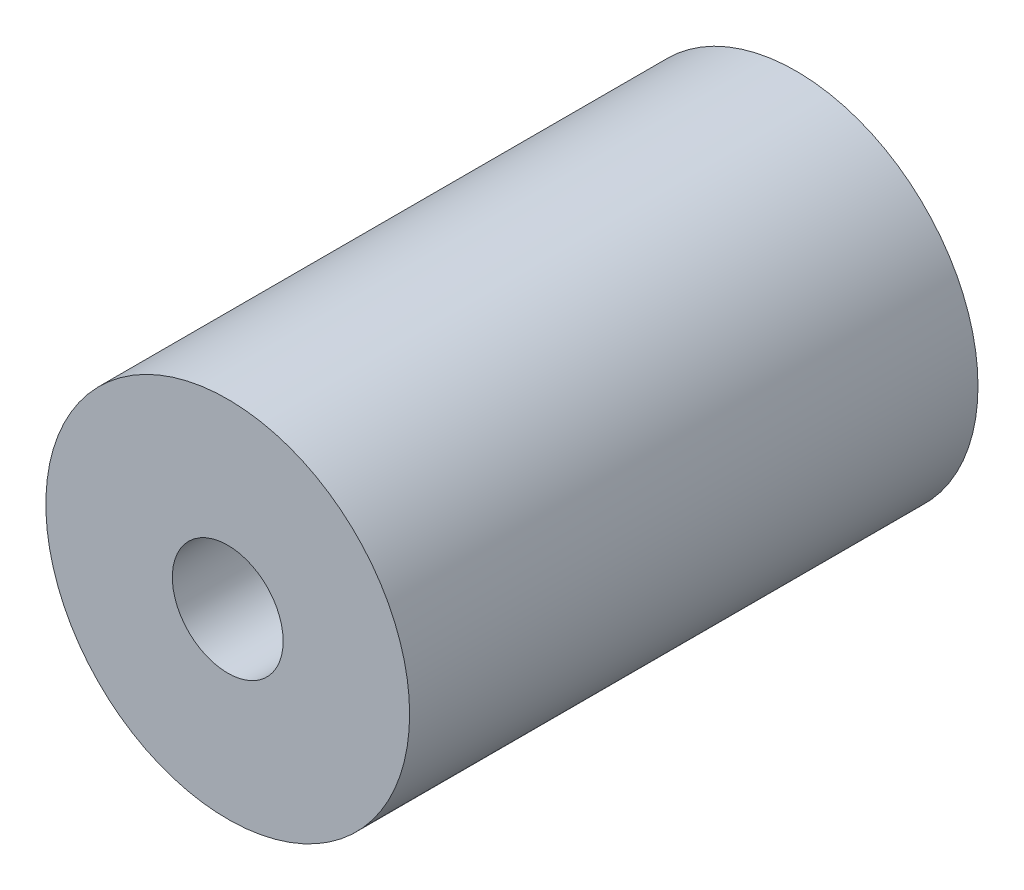
ISO-10303-21;
HEADER;
FILE_DESCRIPTION(('STEP AP214'),'2;1');
FILE_NAME('part.step','',(''),(''),'','','');
FILE_SCHEMA(('AUTOMOTIVE_DESIGN { 1 0 10303 214 1 1 1 1 }'));
ENDSEC;
DATA;
#1=APPLICATION_CONTEXT('core data for automotive mechanical design processes');
#2=APPLICATION_PROTOCOL_DEFINITION('international standard','automotive_design',2000,#1);
#3=PRODUCT_CONTEXT('',#1,'mechanical');
#4=PRODUCT('Part','Part','',(#3));
#5=PRODUCT_RELATED_PRODUCT_CATEGORY('part','',(#4));
#6=PRODUCT_DEFINITION_FORMATION('','',#4);
#7=PRODUCT_DEFINITION_CONTEXT('part definition',#1,'design');
#8=PRODUCT_DEFINITION('design','',#6,#7);
#9=PRODUCT_DEFINITION_SHAPE('','',#8);
#10=(LENGTH_UNIT() NAMED_UNIT(*) SI_UNIT(.MILLI.,.METRE.));
#11=(NAMED_UNIT(*) PLANE_ANGLE_UNIT() SI_UNIT($,.RADIAN.));
#12=(NAMED_UNIT(*) SI_UNIT($,.STERADIAN.) SOLID_ANGLE_UNIT());
#13=UNCERTAINTY_MEASURE_WITH_UNIT(LENGTH_MEASURE(1.E-05),#10,'distance_accuracy_value','');
#14=(GEOMETRIC_REPRESENTATION_CONTEXT(3) GLOBAL_UNCERTAINTY_ASSIGNED_CONTEXT((#13)) GLOBAL_UNIT_ASSIGNED_CONTEXT((#10,
#11,#12)) REPRESENTATION_CONTEXT('',''));
#15=CARTESIAN_POINT('',(0.,0.,0.));
#16=DIRECTION('',(0.,0.,1.));
#17=DIRECTION('',(1.,0.,0.));
#18=AXIS2_PLACEMENT_3D('',#15,#16,#17);
#19=CARTESIAN_POINT('',(0.,0.,10.));
#20=DIRECTION('',(0.,0.,1.));
#21=DIRECTION('',(1.,0.,0.));
#22=AXIS2_PLACEMENT_3D('',#19,#20,#21);
#23=PLANE('',#22);
#24=CARTESIAN_POINT('',(0.,0.,10.));
#25=DIRECTION('',(0.,0.,1.));
#26=DIRECTION('',(1.,0.,0.));
#27=AXIS2_PLACEMENT_3D('',#24,#25,#26);
#28=CIRCLE('',#27,3.2);
#29=CARTESIAN_POINT('',(3.2,0.,10.));
#30=VERTEX_POINT('',#29);
#31=EDGE_CURVE('E10',#30,#30,#28,.T.);
#32=ORIENTED_EDGE('',*,*,#31,.T.);
#33=EDGE_LOOP('',(#32));
#34=FACE_BOUND('',#33,.T.);
#35=CARTESIAN_POINT('',(0.,0.,10.));
#36=DIRECTION('',(0.,0.,1.));
#37=DIRECTION('',(1.,0.,0.));
#38=AXIS2_PLACEMENT_3D('',#35,#36,#37);
#39=CIRCLE('',#38,0.975);
#40=CARTESIAN_POINT('',(0.975,0.,10.));
#41=VERTEX_POINT('',#40);
#42=EDGE_CURVE('E46',#41,#41,#39,.T.);
#43=ORIENTED_EDGE('',*,*,#42,.F.);
#44=EDGE_LOOP('',(#43));
#45=FACE_BOUND('',#44,.T.);
#46=ADVANCED_FACE('F35',(#34,#45),#23,.T.);
#47=CARTESIAN_POINT('',(0.,0.,0.));
#48=DIRECTION('',(0.,0.,1.));
#49=DIRECTION('',(1.,0.,0.));
#50=AXIS2_PLACEMENT_3D('',#47,#48,#49);
#51=PLANE('',#50);
#52=CARTESIAN_POINT('',(0.,0.,0.));
#53=DIRECTION('',(0.,0.,1.));
#54=DIRECTION('',(1.,0.,0.));
#55=AXIS2_PLACEMENT_3D('',#52,#53,#54);
#56=CIRCLE('',#55,3.2);
#57=CARTESIAN_POINT('',(3.2,0.,0.));
#58=VERTEX_POINT('',#57);
#59=EDGE_CURVE('E39',#58,#58,#56,.T.);
#60=ORIENTED_EDGE('',*,*,#59,.F.);
#61=EDGE_LOOP('',(#60));
#62=FACE_BOUND('',#61,.T.);
#63=CARTESIAN_POINT('',(0.,0.,0.));
#64=DIRECTION('',(0.,0.,1.));
#65=DIRECTION('',(1.,0.,0.));
#66=AXIS2_PLACEMENT_3D('',#63,#64,#65);
#67=CIRCLE('',#66,0.975);
#68=CARTESIAN_POINT('',(0.975,0.,0.));
#69=VERTEX_POINT('',#68);
#70=EDGE_CURVE('E48',#69,#69,#67,.T.);
#71=ORIENTED_EDGE('',*,*,#70,.T.);
#72=EDGE_LOOP('',(#71));
#73=FACE_BOUND('',#72,.T.);
#74=ADVANCED_FACE('F58',(#62,#73),#51,.F.);
#75=CARTESIAN_POINT('',(0.,0.,10.));
#76=DIRECTION('',(0.,0.,-1.));
#77=DIRECTION('',(-1.,0.,0.));
#78=AXIS2_PLACEMENT_3D('',#75,#76,#77);
#79=CYLINDRICAL_SURFACE('',#78,3.2);
#80=ORIENTED_EDGE('',*,*,#31,.F.);
#81=EDGE_LOOP('',(#80));
#82=FACE_BOUND('',#81,.T.);
#83=ORIENTED_EDGE('',*,*,#59,.T.);
#84=EDGE_LOOP('',(#83));
#85=FACE_BOUND('',#84,.T.);
#86=ADVANCED_FACE('F37',(#82,#85),#79,.T.);
#87=CARTESIAN_POINT('',(0.,0.,10.));
#88=DIRECTION('',(0.,0.,-1.));
#89=DIRECTION('',(-1.,0.,0.));
#90=AXIS2_PLACEMENT_3D('',#87,#88,#89);
#91=CYLINDRICAL_SURFACE('',#90,0.975);
#92=ORIENTED_EDGE('',*,*,#42,.T.);
#93=EDGE_LOOP('',(#92));
#94=FACE_BOUND('',#93,.T.);
#95=ORIENTED_EDGE('',*,*,#70,.F.);
#96=EDGE_LOOP('',(#95));
#97=FACE_BOUND('',#96,.T.);
#98=ADVANCED_FACE('F54',(#94,#97),#91,.F.);
#99=CLOSED_SHELL('',(#46,#74,#86,#98));
#100=MANIFOLD_SOLID_BREP('B2',#99);
#101=ADVANCED_BREP_SHAPE_REPRESENTATION('',(#18,#100),#14);
#102=SHAPE_DEFINITION_REPRESENTATION(#9,#101);
ENDSEC;
END-ISO-10303-21;
